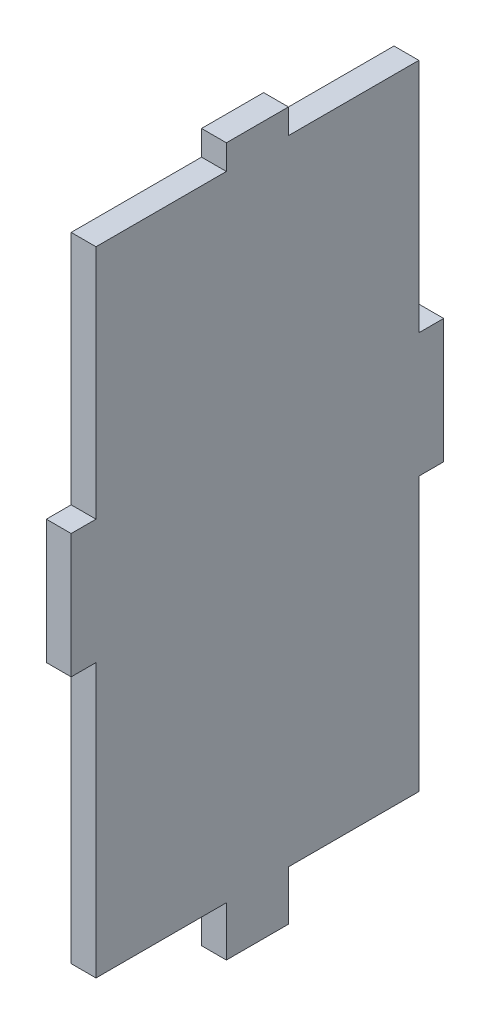
ISO-10303-21;
HEADER;
FILE_DESCRIPTION(('STEP AP214'),'2;1');
FILE_NAME('part.step','',(''),(''),'','','');
FILE_SCHEMA(('AUTOMOTIVE_DESIGN { 1 0 10303 214 1 1 1 1 }'));
ENDSEC;
DATA;
#1=APPLICATION_CONTEXT('core data for automotive mechanical design processes');
#2=APPLICATION_PROTOCOL_DEFINITION('international standard','automotive_design',2000,#1);
#3=PRODUCT_CONTEXT('',#1,'mechanical');
#4=PRODUCT('Part','Part','',(#3));
#5=PRODUCT_RELATED_PRODUCT_CATEGORY('part','',(#4));
#6=PRODUCT_DEFINITION_FORMATION('','',#4);
#7=PRODUCT_DEFINITION_CONTEXT('part definition',#1,'design');
#8=PRODUCT_DEFINITION('design','',#6,#7);
#9=PRODUCT_DEFINITION_SHAPE('','',#8);
#10=(LENGTH_UNIT() NAMED_UNIT(*) SI_UNIT(.MILLI.,.METRE.));
#11=(NAMED_UNIT(*) PLANE_ANGLE_UNIT() SI_UNIT($,.RADIAN.));
#12=(NAMED_UNIT(*) SI_UNIT($,.STERADIAN.) SOLID_ANGLE_UNIT());
#13=UNCERTAINTY_MEASURE_WITH_UNIT(LENGTH_MEASURE(1.E-05),#10,'distance_accuracy_value','');
#14=(GEOMETRIC_REPRESENTATION_CONTEXT(3) GLOBAL_UNCERTAINTY_ASSIGNED_CONTEXT((#13)) GLOBAL_UNIT_ASSIGNED_CONTEXT((#10,
#11,#12)) REPRESENTATION_CONTEXT('',''));
#15=CARTESIAN_POINT('',(0.,0.,0.));
#16=DIRECTION('',(0.,0.,1.));
#17=DIRECTION('',(1.,0.,0.));
#18=AXIS2_PLACEMENT_3D('',#15,#16,#17);
#19=CARTESIAN_POINT('',(2.,32.,0.));
#20=DIRECTION('',(0.,1.,0.));
#21=DIRECTION('',(0.,0.,1.));
#22=AXIS2_PLACEMENT_3D('',#19,#20,#21);
#23=PLANE('',#22);
#24=DIRECTION('',(0.,0.,-1.));
#25=VECTOR('',#24,1.);
#26=CARTESIAN_POINT('',(0.,32.,0.));
#27=LINE('',#26,#25);
#28=CARTESIAN_POINT('',(0.,32.,-26.));
#29=VERTEX_POINT('',#28);
#30=CARTESIAN_POINT('',(0.,32.,-28.));
#31=VERTEX_POINT('',#30);
#32=EDGE_CURVE('E263',#29,#31,#27,.T.);
#33=ORIENTED_EDGE('',*,*,#32,.F.);
#34=DIRECTION('',(-1.,0.,0.));
#35=VECTOR('',#34,1.);
#36=CARTESIAN_POINT('',(2.,32.,-26.));
#37=LINE('',#36,#35);
#38=CARTESIAN_POINT('',(2.,32.,-26.));
#39=VERTEX_POINT('',#38);
#40=EDGE_CURVE('E335',#39,#29,#37,.T.);
#41=ORIENTED_EDGE('',*,*,#40,.F.);
#42=DIRECTION('',(0.,0.,-1.));
#43=VECTOR('',#42,1.);
#44=CARTESIAN_POINT('',(2.,32.,0.));
#45=LINE('',#44,#43);
#46=CARTESIAN_POINT('',(2.,32.,-28.));
#47=VERTEX_POINT('',#46);
#48=EDGE_CURVE('E325',#39,#47,#45,.T.);
#49=ORIENTED_EDGE('',*,*,#48,.T.);
#50=DIRECTION('',(-1.,0.,0.));
#51=VECTOR('',#50,1.);
#52=CARTESIAN_POINT('',(2.,32.,-28.));
#53=LINE('',#52,#51);
#54=EDGE_CURVE('E339',#47,#31,#53,.T.);
#55=ORIENTED_EDGE('',*,*,#54,.T.);
#56=EDGE_LOOP('',(#33,#41,#49,#55));
#57=FACE_BOUND('',#56,.T.);
#58=ADVANCED_FACE('F109',(#57),#23,.T.);
#59=CARTESIAN_POINT('',(2.,0.,-28.));
#60=DIRECTION('',(0.,0.,-1.));
#61=DIRECTION('',(0.,1.,0.));
#62=AXIS2_PLACEMENT_3D('',#59,#60,#61);
#63=PLANE('',#62);
#64=DIRECTION('',(0.,-1.,0.));
#65=VECTOR('',#64,1.);
#66=CARTESIAN_POINT('',(0.,0.,-28.));
#67=LINE('',#66,#65);
#68=CARTESIAN_POINT('',(0.,22.,-28.));
#69=VERTEX_POINT('',#68);
#70=EDGE_CURVE('E259',#31,#69,#67,.T.);
#71=ORIENTED_EDGE('',*,*,#70,.F.);
#72=ORIENTED_EDGE('',*,*,#54,.F.);
#73=DIRECTION('',(0.,-1.,0.));
#74=VECTOR('',#73,1.);
#75=CARTESIAN_POINT('',(2.,0.,-28.));
#76=LINE('',#75,#74);
#77=CARTESIAN_POINT('',(2.,22.,-28.));
#78=VERTEX_POINT('',#77);
#79=EDGE_CURVE('E321',#47,#78,#76,.T.);
#80=ORIENTED_EDGE('',*,*,#79,.T.);
#81=DIRECTION('',(-1.,0.,0.));
#82=VECTOR('',#81,1.);
#83=CARTESIAN_POINT('',(2.,22.,-28.));
#84=LINE('',#83,#82);
#85=EDGE_CURVE('E343',#78,#69,#84,.T.);
#86=ORIENTED_EDGE('',*,*,#85,.T.);
#87=EDGE_LOOP('',(#71,#72,#80,#86));
#88=FACE_BOUND('',#87,.T.);
#89=ADVANCED_FACE('F477',(#88),#63,.T.);
#90=CARTESIAN_POINT('',(2.,22.,0.));
#91=DIRECTION('',(0.,1.,0.));
#92=DIRECTION('',(0.,0.,1.));
#93=AXIS2_PLACEMENT_3D('',#90,#91,#92);
#94=PLANE('',#93);
#95=DIRECTION('',(0.,0.,-1.));
#96=VECTOR('',#95,1.);
#97=CARTESIAN_POINT('',(0.,22.,0.));
#98=LINE('',#97,#96);
#99=CARTESIAN_POINT('',(0.,22.,-26.));
#100=VERTEX_POINT('',#99);
#101=EDGE_CURVE('E254',#100,#69,#98,.T.);
#102=ORIENTED_EDGE('',*,*,#101,.T.);
#103=ORIENTED_EDGE('',*,*,#85,.F.);
#104=DIRECTION('',(0.,0.,-1.));
#105=VECTOR('',#104,1.);
#106=CARTESIAN_POINT('',(2.,22.,0.));
#107=LINE('',#106,#105);
#108=CARTESIAN_POINT('',(2.,22.,-26.));
#109=VERTEX_POINT('',#108);
#110=EDGE_CURVE('E316',#109,#78,#107,.T.);
#111=ORIENTED_EDGE('',*,*,#110,.F.);
#112=DIRECTION('',(-1.,0.,0.));
#113=VECTOR('',#112,1.);
#114=CARTESIAN_POINT('',(2.,22.,-26.));
#115=LINE('',#114,#113);
#116=EDGE_CURVE('E347',#109,#100,#115,.T.);
#117=ORIENTED_EDGE('',*,*,#116,.T.);
#118=EDGE_LOOP('',(#102,#103,#111,#117));
#119=FACE_BOUND('',#118,.T.);
#120=ADVANCED_FACE('F495',(#119),#94,.F.);
#121=CARTESIAN_POINT('',(2.,0.,-26.));
#122=DIRECTION('',(0.,0.,1.));
#123=DIRECTION('',(1.,0.,0.));
#124=AXIS2_PLACEMENT_3D('',#121,#122,#123);
#125=PLANE('',#124);
#126=DIRECTION('',(0.,1.,0.));
#127=VECTOR('',#126,1.);
#128=CARTESIAN_POINT('',(0.,0.,-26.));
#129=LINE('',#128,#127);
#130=CARTESIAN_POINT('',(0.,0.,-26.));
#131=VERTEX_POINT('',#130);
#132=EDGE_CURVE('E250',#131,#100,#129,.T.);
#133=ORIENTED_EDGE('',*,*,#132,.T.);
#134=ORIENTED_EDGE('',*,*,#116,.F.);
#135=DIRECTION('',(0.,1.,0.));
#136=VECTOR('',#135,1.);
#137=CARTESIAN_POINT('',(2.,0.,-26.));
#138=LINE('',#137,#136);
#139=CARTESIAN_POINT('',(2.,0.,-26.));
#140=VERTEX_POINT('',#139);
#141=EDGE_CURVE('E312',#140,#109,#138,.T.);
#142=ORIENTED_EDGE('',*,*,#141,.F.);
#143=DIRECTION('',(-1.,0.,0.));
#144=VECTOR('',#143,1.);
#145=CARTESIAN_POINT('',(2.,0.,-26.));
#146=LINE('',#145,#144);
#147=EDGE_CURVE('E351',#140,#131,#146,.T.);
#148=ORIENTED_EDGE('',*,*,#147,.T.);
#149=EDGE_LOOP('',(#133,#134,#142,#148));
#150=FACE_BOUND('',#149,.T.);
#151=ADVANCED_FACE('F499',(#150),#125,.F.);
#152=CARTESIAN_POINT('',(2.,0.,0.));
#153=DIRECTION('',(0.,1.,0.));
#154=DIRECTION('',(0.,0.,1.));
#155=AXIS2_PLACEMENT_3D('',#152,#153,#154);
#156=PLANE('',#155);
#157=DIRECTION('',(0.,0.,-1.));
#158=VECTOR('',#157,1.);
#159=CARTESIAN_POINT('',(0.,0.,0.));
#160=LINE('',#159,#158);
#161=CARTESIAN_POINT('',(0.,0.,-15.5));
#162=VERTEX_POINT('',#161);
#163=EDGE_CURVE('E246',#162,#131,#160,.T.);
#164=ORIENTED_EDGE('',*,*,#163,.T.);
#165=ORIENTED_EDGE('',*,*,#147,.F.);
#166=DIRECTION('',(0.,0.,-1.));
#167=VECTOR('',#166,1.);
#168=CARTESIAN_POINT('',(2.,0.,0.));
#169=LINE('',#168,#167);
#170=CARTESIAN_POINT('',(2.,0.,-15.5));
#171=VERTEX_POINT('',#170);
#172=EDGE_CURVE('E308',#171,#140,#169,.T.);
#173=ORIENTED_EDGE('',*,*,#172,.F.);
#174=DIRECTION('',(-1.,0.,0.));
#175=VECTOR('',#174,1.);
#176=CARTESIAN_POINT('',(2.,0.,-15.5));
#177=LINE('',#176,#175);
#178=EDGE_CURVE('E355',#171,#162,#177,.T.);
#179=ORIENTED_EDGE('',*,*,#178,.T.);
#180=EDGE_LOOP('',(#164,#165,#173,#179));
#181=FACE_BOUND('',#180,.T.);
#182=ADVANCED_FACE('F503',(#181),#156,.F.);
#183=CARTESIAN_POINT('',(2.,0.,-15.5));
#184=DIRECTION('',(0.,0.,-1.));
#185=DIRECTION('',(-1.,0.,0.));
#186=AXIS2_PLACEMENT_3D('',#183,#184,#185);
#187=PLANE('',#186);
#188=DIRECTION('',(0.,-1.,0.));
#189=VECTOR('',#188,1.);
#190=CARTESIAN_POINT('',(0.,0.,-15.5));
#191=LINE('',#190,#189);
#192=CARTESIAN_POINT('',(0.,-4.,-15.5));
#193=VERTEX_POINT('',#192);
#194=EDGE_CURVE('E242',#162,#193,#191,.T.);
#195=ORIENTED_EDGE('',*,*,#194,.F.);
#196=ORIENTED_EDGE('',*,*,#178,.F.);
#197=DIRECTION('',(0.,-1.,0.));
#198=VECTOR('',#197,1.);
#199=CARTESIAN_POINT('',(2.,0.,-15.5));
#200=LINE('',#199,#198);
#201=CARTESIAN_POINT('',(2.,-4.,-15.5));
#202=VERTEX_POINT('',#201);
#203=EDGE_CURVE('E304',#171,#202,#200,.T.);
#204=ORIENTED_EDGE('',*,*,#203,.T.);
#205=DIRECTION('',(-1.,0.,0.));
#206=VECTOR('',#205,1.);
#207=CARTESIAN_POINT('',(2.,-4.,-15.5));
#208=LINE('',#207,#206);
#209=EDGE_CURVE('E359',#202,#193,#208,.T.);
#210=ORIENTED_EDGE('',*,*,#209,.T.);
#211=EDGE_LOOP('',(#195,#196,#204,#210));
#212=FACE_BOUND('',#211,.T.);
#213=ADVANCED_FACE('F508',(#212),#187,.T.);
#214=CARTESIAN_POINT('',(2.,-4.,0.));
#215=DIRECTION('',(0.,1.,0.));
#216=DIRECTION('',(0.,0.,1.));
#217=AXIS2_PLACEMENT_3D('',#214,#215,#216);
#218=PLANE('',#217);
#219=DIRECTION('',(0.,0.,-1.));
#220=VECTOR('',#219,1.);
#221=CARTESIAN_POINT('',(0.,-4.,0.));
#222=LINE('',#221,#220);
#223=CARTESIAN_POINT('',(0.,-4.,-10.5));
#224=VERTEX_POINT('',#223);
#225=EDGE_CURVE('E238',#224,#193,#222,.T.);
#226=ORIENTED_EDGE('',*,*,#225,.T.);
#227=ORIENTED_EDGE('',*,*,#209,.F.);
#228=DIRECTION('',(0.,0.,-1.));
#229=VECTOR('',#228,1.);
#230=CARTESIAN_POINT('',(2.,-4.,0.));
#231=LINE('',#230,#229);
#232=CARTESIAN_POINT('',(2.,-4.,-10.5));
#233=VERTEX_POINT('',#232);
#234=EDGE_CURVE('E300',#233,#202,#231,.T.);
#235=ORIENTED_EDGE('',*,*,#234,.F.);
#236=DIRECTION('',(-1.,0.,0.));
#237=VECTOR('',#236,1.);
#238=CARTESIAN_POINT('',(2.,-4.,-10.5));
#239=LINE('',#238,#237);
#240=EDGE_CURVE('E363',#233,#224,#239,.T.);
#241=ORIENTED_EDGE('',*,*,#240,.T.);
#242=EDGE_LOOP('',(#226,#227,#235,#241));
#243=FACE_BOUND('',#242,.T.);
#244=ADVANCED_FACE('F512',(#243),#218,.F.);
#245=CARTESIAN_POINT('',(2.,0.,-10.5));
#246=DIRECTION('',(0.,0.,-1.));
#247=DIRECTION('',(-1.,0.,0.));
#248=AXIS2_PLACEMENT_3D('',#245,#246,#247);
#249=PLANE('',#248);
#250=DIRECTION('',(0.,-1.,0.));
#251=VECTOR('',#250,1.);
#252=CARTESIAN_POINT('',(0.,0.,-10.5));
#253=LINE('',#252,#251);
#254=CARTESIAN_POINT('',(0.,0.,-10.5));
#255=VERTEX_POINT('',#254);
#256=EDGE_CURVE('E234',#255,#224,#253,.T.);
#257=ORIENTED_EDGE('',*,*,#256,.T.);
#258=ORIENTED_EDGE('',*,*,#240,.F.);
#259=DIRECTION('',(0.,-1.,0.));
#260=VECTOR('',#259,1.);
#261=CARTESIAN_POINT('',(2.,0.,-10.5));
#262=LINE('',#261,#260);
#263=CARTESIAN_POINT('',(2.,0.,-10.5));
#264=VERTEX_POINT('',#263);
#265=EDGE_CURVE('E296',#264,#233,#262,.T.);
#266=ORIENTED_EDGE('',*,*,#265,.F.);
#267=DIRECTION('',(-1.,0.,0.));
#268=VECTOR('',#267,1.);
#269=CARTESIAN_POINT('',(2.,0.,-10.5));
#270=LINE('',#269,#268);
#271=EDGE_CURVE('E367',#264,#255,#270,.T.);
#272=ORIENTED_EDGE('',*,*,#271,.T.);
#273=EDGE_LOOP('',(#257,#258,#266,#272));
#274=FACE_BOUND('',#273,.T.);
#275=ADVANCED_FACE('F516',(#274),#249,.F.);
#276=CARTESIAN_POINT('',(2.,0.,0.));
#277=DIRECTION('',(0.,1.,0.));
#278=DIRECTION('',(0.,0.,1.));
#279=AXIS2_PLACEMENT_3D('',#276,#277,#278);
#280=PLANE('',#279);
#281=DIRECTION('',(0.,0.,-1.));
#282=VECTOR('',#281,1.);
#283=CARTESIAN_POINT('',(0.,0.,0.));
#284=LINE('',#283,#282);
#285=CARTESIAN_POINT('',(0.,0.,0.));
#286=VERTEX_POINT('',#285);
#287=EDGE_CURVE('E231',#286,#255,#284,.T.);
#288=ORIENTED_EDGE('',*,*,#287,.T.);
#289=ORIENTED_EDGE('',*,*,#271,.F.);
#290=DIRECTION('',(0.,0.,-1.));
#291=VECTOR('',#290,1.);
#292=CARTESIAN_POINT('',(2.,0.,0.));
#293=LINE('',#292,#291);
#294=CARTESIAN_POINT('',(2.,0.,0.));
#295=VERTEX_POINT('',#294);
#296=EDGE_CURVE('E293',#295,#264,#293,.T.);
#297=ORIENTED_EDGE('',*,*,#296,.F.);
#298=DIRECTION('',(-1.,0.,0.));
#299=VECTOR('',#298,1.);
#300=CARTESIAN_POINT('',(2.,0.,0.));
#301=LINE('',#300,#299);
#302=EDGE_CURVE('E371',#295,#286,#301,.T.);
#303=ORIENTED_EDGE('',*,*,#302,.T.);
#304=EDGE_LOOP('',(#288,#289,#297,#303));
#305=FACE_BOUND('',#304,.T.);
#306=ADVANCED_FACE('F521',(#305),#280,.F.);
#307=CARTESIAN_POINT('',(2.,0.,0.));
#308=DIRECTION('',(0.,0.,1.));
#309=DIRECTION('',(1.,0.,0.));
#310=AXIS2_PLACEMENT_3D('',#307,#308,#309);
#311=PLANE('',#310);
#312=DIRECTION('',(0.,1.,0.));
#313=VECTOR('',#312,1.);
#314=CARTESIAN_POINT('',(0.,0.,0.));
#315=LINE('',#314,#313);
#316=CARTESIAN_POINT('',(0.,22.,0.));
#317=VERTEX_POINT('',#316);
#318=EDGE_CURVE('E217',#286,#317,#315,.T.);
#319=ORIENTED_EDGE('',*,*,#318,.F.);
#320=ORIENTED_EDGE('',*,*,#302,.F.);
#321=DIRECTION('',(0.,1.,0.));
#322=VECTOR('',#321,1.);
#323=CARTESIAN_POINT('',(2.,0.,0.));
#324=LINE('',#323,#322);
#325=CARTESIAN_POINT('',(2.,22.,0.));
#326=VERTEX_POINT('',#325);
#327=EDGE_CURVE('E279',#295,#326,#324,.T.);
#328=ORIENTED_EDGE('',*,*,#327,.T.);
#329=DIRECTION('',(-1.,0.,0.));
#330=VECTOR('',#329,1.);
#331=CARTESIAN_POINT('',(2.,22.,0.));
#332=LINE('',#331,#330);
#333=EDGE_CURVE('E375',#326,#317,#332,.T.);
#334=ORIENTED_EDGE('',*,*,#333,.T.);
#335=EDGE_LOOP('',(#319,#320,#328,#334));
#336=FACE_BOUND('',#335,.T.);
#337=ADVANCED_FACE('F523',(#336),#311,.T.);
#338=CARTESIAN_POINT('',(2.,22.,0.));
#339=DIRECTION('',(0.,-1.,0.));
#340=DIRECTION('',(0.,0.,-1.));
#341=AXIS2_PLACEMENT_3D('',#338,#339,#340);
#342=PLANE('',#341);
#343=DIRECTION('',(0.,0.,1.));
#344=VECTOR('',#343,1.);
#345=CARTESIAN_POINT('',(0.,22.,0.));
#346=LINE('',#345,#344);
#347=CARTESIAN_POINT('',(0.,22.,2.));
#348=VERTEX_POINT('',#347);
#349=EDGE_CURVE('E224',#317,#348,#346,.T.);
#350=ORIENTED_EDGE('',*,*,#349,.F.);
#351=ORIENTED_EDGE('',*,*,#333,.F.);
#352=DIRECTION('',(0.,0.,1.));
#353=VECTOR('',#352,1.);
#354=CARTESIAN_POINT('',(2.,22.,0.));
#355=LINE('',#354,#353);
#356=CARTESIAN_POINT('',(2.,22.,2.));
#357=VERTEX_POINT('',#356);
#358=EDGE_CURVE('E286',#326,#357,#355,.T.);
#359=ORIENTED_EDGE('',*,*,#358,.T.);
#360=DIRECTION('',(-1.,0.,0.));
#361=VECTOR('',#360,1.);
#362=CARTESIAN_POINT('',(2.,22.,2.));
#363=LINE('',#362,#361);
#364=EDGE_CURVE('E379',#357,#348,#363,.T.);
#365=ORIENTED_EDGE('',*,*,#364,.T.);
#366=EDGE_LOOP('',(#350,#351,#359,#365));
#367=FACE_BOUND('',#366,.T.);
#368=ADVANCED_FACE('F406',(#367),#342,.T.);
#369=CARTESIAN_POINT('',(2.,0.,2.));
#370=DIRECTION('',(0.,0.,-1.));
#371=DIRECTION('',(0.,1.,0.));
#372=AXIS2_PLACEMENT_3D('',#369,#370,#371);
#373=PLANE('',#372);
#374=DIRECTION('',(0.,-1.,0.));
#375=VECTOR('',#374,1.);
#376=CARTESIAN_POINT('',(0.,0.,2.));
#377=LINE('',#376,#375);
#378=CARTESIAN_POINT('',(0.,32.,2.));
#379=VERTEX_POINT('',#378);
#380=EDGE_CURVE('E220',#379,#348,#377,.T.);
#381=ORIENTED_EDGE('',*,*,#380,.T.);
#382=ORIENTED_EDGE('',*,*,#364,.F.);
#383=DIRECTION('',(0.,-1.,0.));
#384=VECTOR('',#383,1.);
#385=CARTESIAN_POINT('',(2.,0.,2.));
#386=LINE('',#385,#384);
#387=CARTESIAN_POINT('',(2.,32.,2.));
#388=VERTEX_POINT('',#387);
#389=EDGE_CURVE('E282',#388,#357,#386,.T.);
#390=ORIENTED_EDGE('',*,*,#389,.F.);
#391=DIRECTION('',(-1.,0.,0.));
#392=VECTOR('',#391,1.);
#393=CARTESIAN_POINT('',(2.,32.,2.));
#394=LINE('',#393,#392);
#395=EDGE_CURVE('E195',#388,#379,#394,.T.);
#396=ORIENTED_EDGE('',*,*,#395,.T.);
#397=EDGE_LOOP('',(#381,#382,#390,#396));
#398=FACE_BOUND('',#397,.T.);
#399=ADVANCED_FACE('F390',(#398),#373,.F.);
#400=CARTESIAN_POINT('',(2.,32.,0.));
#401=DIRECTION('',(0.,-1.,0.));
#402=DIRECTION('',(0.,0.,-1.));
#403=AXIS2_PLACEMENT_3D('',#400,#401,#402);
#404=PLANE('',#403);
#405=DIRECTION('',(0.,0.,1.));
#406=VECTOR('',#405,1.);
#407=CARTESIAN_POINT('',(0.,32.,0.));
#408=LINE('',#407,#406);
#409=CARTESIAN_POINT('',(0.,32.,0.));
#410=VERTEX_POINT('',#409);
#411=EDGE_CURVE('E215',#410,#379,#408,.T.);
#412=ORIENTED_EDGE('',*,*,#411,.T.);
#413=ORIENTED_EDGE('',*,*,#395,.F.);
#414=DIRECTION('',(0.,0.,1.));
#415=VECTOR('',#414,1.);
#416=CARTESIAN_POINT('',(2.,32.,0.));
#417=LINE('',#416,#415);
#418=CARTESIAN_POINT('',(2.,32.,0.));
#419=VERTEX_POINT('',#418);
#420=EDGE_CURVE('E277',#419,#388,#417,.T.);
#421=ORIENTED_EDGE('',*,*,#420,.F.);
#422=DIRECTION('',(-1.,0.,0.));
#423=VECTOR('',#422,1.);
#424=CARTESIAN_POINT('',(2.,32.,0.));
#425=LINE('',#424,#423);
#426=EDGE_CURVE('E187',#419,#410,#425,.T.);
#427=ORIENTED_EDGE('',*,*,#426,.T.);
#428=EDGE_LOOP('',(#412,#413,#421,#427));
#429=FACE_BOUND('',#428,.T.);
#430=ADVANCED_FACE('F445',(#429),#404,.F.);
#431=CARTESIAN_POINT('',(0.,51.,-26.));
#432=VERTEX_POINT('',#431);
#433=EDGE_CURVE('E256',#29,#432,#129,.T.);
#434=ORIENTED_EDGE('',*,*,#433,.T.);
#435=DIRECTION('',(-1.,0.,0.));
#436=VECTOR('',#435,1.);
#437=CARTESIAN_POINT('',(2.,51.,-26.));
#438=LINE('',#437,#436);
#439=CARTESIAN_POINT('',(2.,51.,-26.));
#440=VERTEX_POINT('',#439);
#441=EDGE_CURVE('E332',#440,#432,#438,.T.);
#442=ORIENTED_EDGE('',*,*,#441,.F.);
#443=EDGE_CURVE('E318',#39,#440,#138,.T.);
#444=ORIENTED_EDGE('',*,*,#443,.F.);
#445=ORIENTED_EDGE('',*,*,#40,.T.);
#446=EDGE_LOOP('',(#434,#442,#444,#445));
#447=FACE_BOUND('',#446,.T.);
#448=ADVANCED_FACE('F489',(#447),#125,.F.);
#449=CARTESIAN_POINT('',(0.,51.,0.));
#450=VERTEX_POINT('',#449);
#451=EDGE_CURVE('E212',#410,#450,#315,.T.);
#452=ORIENTED_EDGE('',*,*,#451,.F.);
#453=ORIENTED_EDGE('',*,*,#426,.F.);
#454=CARTESIAN_POINT('',(2.,51.,0.));
#455=VERTEX_POINT('',#454);
#456=EDGE_CURVE('E275',#419,#455,#324,.T.);
#457=ORIENTED_EDGE('',*,*,#456,.T.);
#458=DIRECTION('',(-1.,0.,0.));
#459=VECTOR('',#458,1.);
#460=CARTESIAN_POINT('',(2.,51.,0.));
#461=LINE('',#460,#459);
#462=EDGE_CURVE('E180',#455,#450,#461,.T.);
#463=ORIENTED_EDGE('',*,*,#462,.T.);
#464=EDGE_LOOP('',(#452,#453,#457,#463));
#465=FACE_BOUND('',#464,.T.);
#466=ADVANCED_FACE('F448',(#465),#311,.T.);
#467=CARTESIAN_POINT('',(0.,0.,0.));
#468=DIRECTION('',(1.,0.,0.));
#469=DIRECTION('',(0.,0.,-1.));
#470=AXIS2_PLACEMENT_3D('',#467,#468,#469);
#471=PLANE('',#470);
#472=DIRECTION('',(0.,0.,-1.));
#473=VECTOR('',#472,1.);
#474=CARTESIAN_POINT('',(0.,51.,0.));
#475=LINE('',#474,#473);
#476=CARTESIAN_POINT('',(0.,51.,-10.5));
#477=VERTEX_POINT('',#476);
#478=EDGE_CURVE('E209',#450,#477,#475,.T.);
#479=ORIENTED_EDGE('',*,*,#478,.T.);
#480=DIRECTION('',(0.,1.,0.));
#481=VECTOR('',#480,1.);
#482=CARTESIAN_POINT('',(0.,51.,-10.5));
#483=LINE('',#482,#481);
#484=CARTESIAN_POINT('',(0.,53.,-10.5));
#485=VERTEX_POINT('',#484);
#486=EDGE_CURVE('E171',#477,#485,#483,.T.);
#487=ORIENTED_EDGE('',*,*,#486,.T.);
#488=DIRECTION('',(0.,0.,-1.));
#489=VECTOR('',#488,1.);
#490=CARTESIAN_POINT('',(0.,53.,-10.5));
#491=LINE('',#490,#489);
#492=CARTESIAN_POINT('',(0.,53.,-15.5));
#493=VERTEX_POINT('',#492);
#494=EDGE_CURVE('E154',#485,#493,#491,.T.);
#495=ORIENTED_EDGE('',*,*,#494,.T.);
#496=DIRECTION('',(0.,1.,0.));
#497=VECTOR('',#496,1.);
#498=CARTESIAN_POINT('',(0.,51.,-15.5));
#499=LINE('',#498,#497);
#500=CARTESIAN_POINT('',(0.,51.,-15.5));
#501=VERTEX_POINT('',#500);
#502=EDGE_CURVE('E162',#501,#493,#499,.T.);
#503=ORIENTED_EDGE('',*,*,#502,.F.);
#504=EDGE_CURVE('E160',#501,#432,#475,.T.);
#505=ORIENTED_EDGE('',*,*,#504,.T.);
#506=ORIENTED_EDGE('',*,*,#433,.F.);
#507=ORIENTED_EDGE('',*,*,#32,.T.);
#508=ORIENTED_EDGE('',*,*,#70,.T.);
#509=ORIENTED_EDGE('',*,*,#101,.F.);
#510=ORIENTED_EDGE('',*,*,#132,.F.);
#511=ORIENTED_EDGE('',*,*,#163,.F.);
#512=ORIENTED_EDGE('',*,*,#194,.T.);
#513=ORIENTED_EDGE('',*,*,#225,.F.);
#514=ORIENTED_EDGE('',*,*,#256,.F.);
#515=ORIENTED_EDGE('',*,*,#287,.F.);
#516=ORIENTED_EDGE('',*,*,#318,.T.);
#517=ORIENTED_EDGE('',*,*,#349,.T.);
#518=ORIENTED_EDGE('',*,*,#380,.F.);
#519=ORIENTED_EDGE('',*,*,#411,.F.);
#520=ORIENTED_EDGE('',*,*,#451,.T.);
#521=EDGE_LOOP('',(#479,#487,#495,#503,#505,#506,#507,#508,#509,#510,#511,#512,#513,#514,#515,
#516,#517,#518,#519,#520));
#522=FACE_BOUND('',#521,.T.);
#523=ADVANCED_FACE('F170',(#522),#471,.F.);
#524=CARTESIAN_POINT('',(2.,0.,0.));
#525=DIRECTION('',(1.,0.,0.));
#526=DIRECTION('',(0.,0.,-1.));
#527=AXIS2_PLACEMENT_3D('',#524,#525,#526);
#528=PLANE('',#527);
#529=DIRECTION('',(0.,0.,-1.));
#530=VECTOR('',#529,1.);
#531=CARTESIAN_POINT('',(2.,51.,0.));
#532=LINE('',#531,#530);
#533=CARTESIAN_POINT('',(2.,51.,-10.5));
#534=VERTEX_POINT('',#533);
#535=EDGE_CURVE('E272',#455,#534,#532,.T.);
#536=ORIENTED_EDGE('',*,*,#535,.F.);
#537=ORIENTED_EDGE('',*,*,#456,.F.);
#538=ORIENTED_EDGE('',*,*,#420,.T.);
#539=ORIENTED_EDGE('',*,*,#389,.T.);
#540=ORIENTED_EDGE('',*,*,#358,.F.);
#541=ORIENTED_EDGE('',*,*,#327,.F.);
#542=ORIENTED_EDGE('',*,*,#296,.T.);
#543=ORIENTED_EDGE('',*,*,#265,.T.);
#544=ORIENTED_EDGE('',*,*,#234,.T.);
#545=ORIENTED_EDGE('',*,*,#203,.F.);
#546=ORIENTED_EDGE('',*,*,#172,.T.);
#547=ORIENTED_EDGE('',*,*,#141,.T.);
#548=ORIENTED_EDGE('',*,*,#110,.T.);
#549=ORIENTED_EDGE('',*,*,#79,.F.);
#550=ORIENTED_EDGE('',*,*,#48,.F.);
#551=ORIENTED_EDGE('',*,*,#443,.T.);
#552=CARTESIAN_POINT('',(2.,51.,-15.5));
#553=VERTEX_POINT('',#552);
#554=EDGE_CURVE('E270',#553,#440,#532,.T.);
#555=ORIENTED_EDGE('',*,*,#554,.F.);
#556=DIRECTION('',(0.,1.,0.));
#557=VECTOR('',#556,1.);
#558=CARTESIAN_POINT('',(2.,51.,-15.5));
#559=LINE('',#558,#557);
#560=CARTESIAN_POINT('',(2.,53.,-15.5));
#561=VERTEX_POINT('',#560);
#562=EDGE_CURVE('E202',#553,#561,#559,.T.);
#563=ORIENTED_EDGE('',*,*,#562,.T.);
#564=DIRECTION('',(0.,0.,-1.));
#565=VECTOR('',#564,1.);
#566=CARTESIAN_POINT('',(2.,53.,-10.5));
#567=LINE('',#566,#565);
#568=CARTESIAN_POINT('',(2.,53.,-10.5));
#569=VERTEX_POINT('',#568);
#570=EDGE_CURVE('E157',#569,#561,#567,.T.);
#571=ORIENTED_EDGE('',*,*,#570,.F.);
#572=DIRECTION('',(0.,1.,0.));
#573=VECTOR('',#572,1.);
#574=CARTESIAN_POINT('',(2.,51.,-10.5));
#575=LINE('',#574,#573);
#576=EDGE_CURVE('E167',#534,#569,#575,.T.);
#577=ORIENTED_EDGE('',*,*,#576,.F.);
#578=EDGE_LOOP('',(#536,#537,#538,#539,#540,#541,#542,#543,#544,#545,#546,#547,#548,#549,#550,
#551,#555,#563,#571,#577));
#579=FACE_BOUND('',#578,.T.);
#580=ADVANCED_FACE('F482',(#579),#528,.T.);
#581=CARTESIAN_POINT('',(2.,51.,0.));
#582=DIRECTION('',(0.,1.,0.));
#583=DIRECTION('',(0.,0.,1.));
#584=AXIS2_PLACEMENT_3D('',#581,#582,#583);
#585=PLANE('',#584);
#586=ORIENTED_EDGE('',*,*,#535,.T.);
#587=DIRECTION('',(-1.,0.,0.));
#588=VECTOR('',#587,1.);
#589=CARTESIAN_POINT('',(2.,51.,-10.5));
#590=LINE('',#589,#588);
#591=EDGE_CURVE('E120',#534,#477,#590,.T.);
#592=ORIENTED_EDGE('',*,*,#591,.T.);
#593=ORIENTED_EDGE('',*,*,#478,.F.);
#594=ORIENTED_EDGE('',*,*,#462,.F.);
#595=EDGE_LOOP('',(#586,#592,#593,#594));
#596=FACE_BOUND('',#595,.T.);
#597=ADVANCED_FACE('F525',(#596),#585,.T.);
#598=DIRECTION('',(-1.,0.,0.));
#599=VECTOR('',#598,1.);
#600=CARTESIAN_POINT('',(2.,51.,-15.5));
#601=LINE('',#600,#599);
#602=EDGE_CURVE('E12',#553,#501,#601,.T.);
#603=ORIENTED_EDGE('',*,*,#602,.F.);
#604=ORIENTED_EDGE('',*,*,#554,.T.);
#605=ORIENTED_EDGE('',*,*,#441,.T.);
#606=ORIENTED_EDGE('',*,*,#504,.F.);
#607=EDGE_LOOP('',(#603,#604,#605,#606));
#608=FACE_BOUND('',#607,.T.);
#609=ADVANCED_FACE('F490',(#608),#585,.T.);
#610=CARTESIAN_POINT('',(2.,53.,-10.5));
#611=DIRECTION('',(0.,1.,0.));
#612=DIRECTION('',(0.,0.,1.));
#613=AXIS2_PLACEMENT_3D('',#610,#611,#612);
#614=PLANE('',#613);
#615=ORIENTED_EDGE('',*,*,#494,.F.);
#616=DIRECTION('',(-1.,0.,0.));
#617=VECTOR('',#616,1.);
#618=CARTESIAN_POINT('',(2.,53.,-10.5));
#619=LINE('',#618,#617);
#620=EDGE_CURVE('E113',#569,#485,#619,.T.);
#621=ORIENTED_EDGE('',*,*,#620,.F.);
#622=ORIENTED_EDGE('',*,*,#570,.T.);
#623=DIRECTION('',(-1.,0.,0.));
#624=VECTOR('',#623,1.);
#625=CARTESIAN_POINT('',(2.,53.,-15.5));
#626=LINE('',#625,#624);
#627=EDGE_CURVE('E150',#561,#493,#626,.T.);
#628=ORIENTED_EDGE('',*,*,#627,.T.);
#629=EDGE_LOOP('',(#615,#621,#622,#628));
#630=FACE_BOUND('',#629,.T.);
#631=ADVANCED_FACE('F152',(#630),#614,.T.);
#632=CARTESIAN_POINT('',(2.,51.,-10.5));
#633=DIRECTION('',(0.,0.,1.));
#634=DIRECTION('',(1.,0.,0.));
#635=AXIS2_PLACEMENT_3D('',#632,#633,#634);
#636=PLANE('',#635);
#637=ORIENTED_EDGE('',*,*,#486,.F.);
#638=ORIENTED_EDGE('',*,*,#591,.F.);
#639=ORIENTED_EDGE('',*,*,#576,.T.);
#640=ORIENTED_EDGE('',*,*,#620,.T.);
#641=EDGE_LOOP('',(#637,#638,#639,#640));
#642=FACE_BOUND('',#641,.T.);
#643=ADVANCED_FACE('F111',(#642),#636,.T.);
#644=CARTESIAN_POINT('',(2.,51.,-15.5));
#645=DIRECTION('',(0.,0.,1.));
#646=DIRECTION('',(1.,0.,0.));
#647=AXIS2_PLACEMENT_3D('',#644,#645,#646);
#648=PLANE('',#647);
#649=ORIENTED_EDGE('',*,*,#502,.T.);
#650=ORIENTED_EDGE('',*,*,#627,.F.);
#651=ORIENTED_EDGE('',*,*,#562,.F.);
#652=ORIENTED_EDGE('',*,*,#602,.T.);
#653=EDGE_LOOP('',(#649,#650,#651,#652));
#654=FACE_BOUND('',#653,.T.);
#655=ADVANCED_FACE('F163',(#654),#648,.F.);
#656=CLOSED_SHELL('',(#58,#89,#120,#151,#182,#213,#244,#275,#306,#337,#368,#399,#430,#448,#466,
#523,#580,#597,#609,#631,#643,#655));
#657=MANIFOLD_SOLID_BREP('B2',#656);
#658=ADVANCED_BREP_SHAPE_REPRESENTATION('',(#18,#657),#14);
#659=SHAPE_DEFINITION_REPRESENTATION(#9,#658);
ENDSEC;
END-ISO-10303-21;
